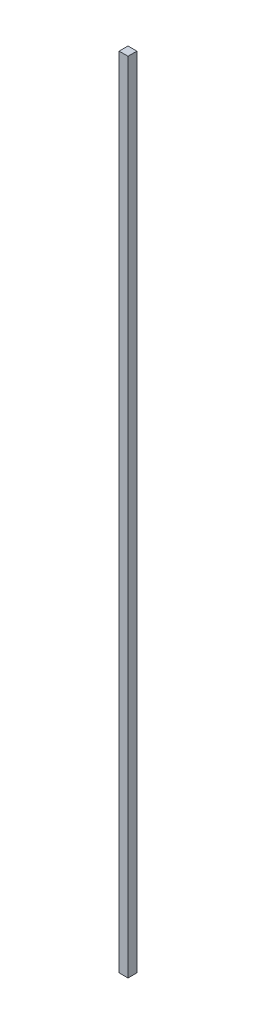
ISO-10303-21;
HEADER;
FILE_DESCRIPTION(('STEP AP214'),'2;1');
FILE_NAME('part.step','',(''),(''),'','','');
FILE_SCHEMA(('AUTOMOTIVE_DESIGN { 1 0 10303 214 1 1 1 1 }'));
ENDSEC;
DATA;
#1=APPLICATION_CONTEXT('core data for automotive mechanical design processes');
#2=APPLICATION_PROTOCOL_DEFINITION('international standard','automotive_design',2000,#1);
#3=PRODUCT_CONTEXT('',#1,'mechanical');
#4=PRODUCT('Part','Part','',(#3));
#5=PRODUCT_RELATED_PRODUCT_CATEGORY('part','',(#4));
#6=PRODUCT_DEFINITION_FORMATION('','',#4);
#7=PRODUCT_DEFINITION_CONTEXT('part definition',#1,'design');
#8=PRODUCT_DEFINITION('design','',#6,#7);
#9=PRODUCT_DEFINITION_SHAPE('','',#8);
#10=(LENGTH_UNIT() NAMED_UNIT(*) SI_UNIT(.MILLI.,.METRE.));
#11=(NAMED_UNIT(*) PLANE_ANGLE_UNIT() SI_UNIT($,.RADIAN.));
#12=(NAMED_UNIT(*) SI_UNIT($,.STERADIAN.) SOLID_ANGLE_UNIT());
#13=UNCERTAINTY_MEASURE_WITH_UNIT(LENGTH_MEASURE(1.E-05),#10,'distance_accuracy_value','');
#14=(GEOMETRIC_REPRESENTATION_CONTEXT(3) GLOBAL_UNCERTAINTY_ASSIGNED_CONTEXT((#13)) GLOBAL_UNIT_ASSIGNED_CONTEXT((#10,
#11,#12)) REPRESENTATION_CONTEXT('',''));
#15=CARTESIAN_POINT('',(0.,0.,0.));
#16=DIRECTION('',(0.,0.,1.));
#17=DIRECTION('',(1.,0.,0.));
#18=AXIS2_PLACEMENT_3D('',#15,#16,#17);
#19=CARTESIAN_POINT('',(0.,2286.,0.));
#20=DIRECTION('',(1.,0.,0.));
#21=DIRECTION('',(0.,0.,-1.));
#22=AXIS2_PLACEMENT_3D('',#19,#20,#21);
#23=PLANE('',#22);
#24=DIRECTION('',(0.,0.,1.));
#25=VECTOR('',#24,1.);
#26=CARTESIAN_POINT('',(0.,0.,0.));
#27=LINE('',#26,#25);
#28=CARTESIAN_POINT('',(0.,0.,0.));
#29=VERTEX_POINT('',#28);
#30=CARTESIAN_POINT('',(0.,0.,25.4));
#31=VERTEX_POINT('',#30);
#32=EDGE_CURVE('E95',#29,#31,#27,.T.);
#33=ORIENTED_EDGE('',*,*,#32,.T.);
#34=DIRECTION('',(0.,-1.,0.));
#35=VECTOR('',#34,1.);
#36=CARTESIAN_POINT('',(0.,2286.,25.4));
#37=LINE('',#36,#35);
#38=CARTESIAN_POINT('',(0.,2286.,25.4));
#39=VERTEX_POINT('',#38);
#40=EDGE_CURVE('E11',#39,#31,#37,.T.);
#41=ORIENTED_EDGE('',*,*,#40,.F.);
#42=DIRECTION('',(0.,0.,1.));
#43=VECTOR('',#42,1.);
#44=CARTESIAN_POINT('',(0.,2286.,0.));
#45=LINE('',#44,#43);
#46=CARTESIAN_POINT('',(0.,2286.,0.));
#47=VERTEX_POINT('',#46);
#48=EDGE_CURVE('E81',#47,#39,#45,.T.);
#49=ORIENTED_EDGE('',*,*,#48,.F.);
#50=DIRECTION('',(0.,-1.,0.));
#51=VECTOR('',#50,1.);
#52=CARTESIAN_POINT('',(0.,2286.,0.));
#53=LINE('',#52,#51);
#54=EDGE_CURVE('E48',#47,#29,#53,.T.);
#55=ORIENTED_EDGE('',*,*,#54,.T.);
#56=EDGE_LOOP('',(#33,#41,#49,#55));
#57=FACE_BOUND('',#56,.T.);
#58=ADVANCED_FACE('F32',(#57),#23,.F.);
#59=CARTESIAN_POINT('',(0.,2286.,25.4));
#60=DIRECTION('',(0.,0.,-1.));
#61=DIRECTION('',(-1.,0.,0.));
#62=AXIS2_PLACEMENT_3D('',#59,#60,#61);
#63=PLANE('',#62);
#64=DIRECTION('',(1.,0.,0.));
#65=VECTOR('',#64,1.);
#66=CARTESIAN_POINT('',(0.,0.,25.4));
#67=LINE('',#66,#65);
#68=CARTESIAN_POINT('',(25.4,0.,25.4));
#69=VERTEX_POINT('',#68);
#70=EDGE_CURVE('E86',#31,#69,#67,.T.);
#71=ORIENTED_EDGE('',*,*,#70,.T.);
#72=DIRECTION('',(0.,-1.,0.));
#73=VECTOR('',#72,1.);
#74=CARTESIAN_POINT('',(25.4,2286.,25.4));
#75=LINE('',#74,#73);
#76=CARTESIAN_POINT('',(25.4,2286.,25.4));
#77=VERTEX_POINT('',#76);
#78=EDGE_CURVE('E40',#77,#69,#75,.T.);
#79=ORIENTED_EDGE('',*,*,#78,.F.);
#80=DIRECTION('',(1.,0.,0.));
#81=VECTOR('',#80,1.);
#82=CARTESIAN_POINT('',(0.,2286.,25.4));
#83=LINE('',#82,#81);
#84=EDGE_CURVE('E73',#39,#77,#83,.T.);
#85=ORIENTED_EDGE('',*,*,#84,.F.);
#86=ORIENTED_EDGE('',*,*,#40,.T.);
#87=EDGE_LOOP('',(#71,#79,#85,#86));
#88=FACE_BOUND('',#87,.T.);
#89=ADVANCED_FACE('F85',(#88),#63,.F.);
#90=CARTESIAN_POINT('',(25.4,2286.,0.));
#91=DIRECTION('',(1.,0.,0.));
#92=DIRECTION('',(0.,0.,-1.));
#93=AXIS2_PLACEMENT_3D('',#90,#91,#92);
#94=PLANE('',#93);
#95=DIRECTION('',(0.,0.,1.));
#96=VECTOR('',#95,1.);
#97=CARTESIAN_POINT('',(25.4,0.,0.));
#98=LINE('',#97,#96);
#99=CARTESIAN_POINT('',(25.4,0.,0.));
#100=VERTEX_POINT('',#99);
#101=EDGE_CURVE('E98',#100,#69,#98,.T.);
#102=ORIENTED_EDGE('',*,*,#101,.F.);
#103=DIRECTION('',(0.,-1.,0.));
#104=VECTOR('',#103,1.);
#105=CARTESIAN_POINT('',(25.4,2286.,0.));
#106=LINE('',#105,#104);
#107=CARTESIAN_POINT('',(25.4,2286.,0.));
#108=VERTEX_POINT('',#107);
#109=EDGE_CURVE('E62',#108,#100,#106,.T.);
#110=ORIENTED_EDGE('',*,*,#109,.F.);
#111=DIRECTION('',(0.,0.,1.));
#112=VECTOR('',#111,1.);
#113=CARTESIAN_POINT('',(25.4,2286.,0.));
#114=LINE('',#113,#112);
#115=EDGE_CURVE('E80',#108,#77,#114,.T.);
#116=ORIENTED_EDGE('',*,*,#115,.T.);
#117=ORIENTED_EDGE('',*,*,#78,.T.);
#118=EDGE_LOOP('',(#102,#110,#116,#117));
#119=FACE_BOUND('',#118,.T.);
#120=ADVANCED_FACE('F89',(#119),#94,.T.);
#121=CARTESIAN_POINT('',(0.,2286.,0.));
#122=DIRECTION('',(0.,0.,-1.));
#123=DIRECTION('',(-1.,0.,0.));
#124=AXIS2_PLACEMENT_3D('',#121,#122,#123);
#125=PLANE('',#124);
#126=DIRECTION('',(1.,0.,0.));
#127=VECTOR('',#126,1.);
#128=CARTESIAN_POINT('',(0.,0.,0.));
#129=LINE('',#128,#127);
#130=EDGE_CURVE('E100',#29,#100,#129,.T.);
#131=ORIENTED_EDGE('',*,*,#130,.F.);
#132=ORIENTED_EDGE('',*,*,#54,.F.);
#133=DIRECTION('',(1.,0.,0.));
#134=VECTOR('',#133,1.);
#135=CARTESIAN_POINT('',(0.,2286.,0.));
#136=LINE('',#135,#134);
#137=EDGE_CURVE('E90',#47,#108,#136,.T.);
#138=ORIENTED_EDGE('',*,*,#137,.T.);
#139=ORIENTED_EDGE('',*,*,#109,.T.);
#140=EDGE_LOOP('',(#131,#132,#138,#139));
#141=FACE_BOUND('',#140,.T.);
#142=ADVANCED_FACE('F106',(#141),#125,.T.);
#143=CARTESIAN_POINT('',(0.,2286.,0.));
#144=DIRECTION('',(0.,1.,0.));
#145=DIRECTION('',(0.,0.,1.));
#146=AXIS2_PLACEMENT_3D('',#143,#144,#145);
#147=PLANE('',#146);
#148=ORIENTED_EDGE('',*,*,#48,.T.);
#149=ORIENTED_EDGE('',*,*,#84,.T.);
#150=ORIENTED_EDGE('',*,*,#115,.F.);
#151=ORIENTED_EDGE('',*,*,#137,.F.);
#152=EDGE_LOOP('',(#148,#149,#150,#151));
#153=FACE_BOUND('',#152,.T.);
#154=ADVANCED_FACE('F77',(#153),#147,.T.);
#155=CARTESIAN_POINT('',(0.,0.,0.));
#156=DIRECTION('',(0.,1.,0.));
#157=DIRECTION('',(0.,0.,1.));
#158=AXIS2_PLACEMENT_3D('',#155,#156,#157);
#159=PLANE('',#158);
#160=ORIENTED_EDGE('',*,*,#32,.F.);
#161=ORIENTED_EDGE('',*,*,#130,.T.);
#162=ORIENTED_EDGE('',*,*,#101,.T.);
#163=ORIENTED_EDGE('',*,*,#70,.F.);
#164=EDGE_LOOP('',(#160,#161,#162,#163));
#165=FACE_BOUND('',#164,.T.);
#166=ADVANCED_FACE('F105',(#165),#159,.F.);
#167=CLOSED_SHELL('',(#58,#89,#120,#142,#154,#166));
#168=MANIFOLD_SOLID_BREP('B2',#167);
#169=ADVANCED_BREP_SHAPE_REPRESENTATION('',(#18,#168),#14);
#170=SHAPE_DEFINITION_REPRESENTATION(#9,#169);
ENDSEC;
END-ISO-10303-21;
